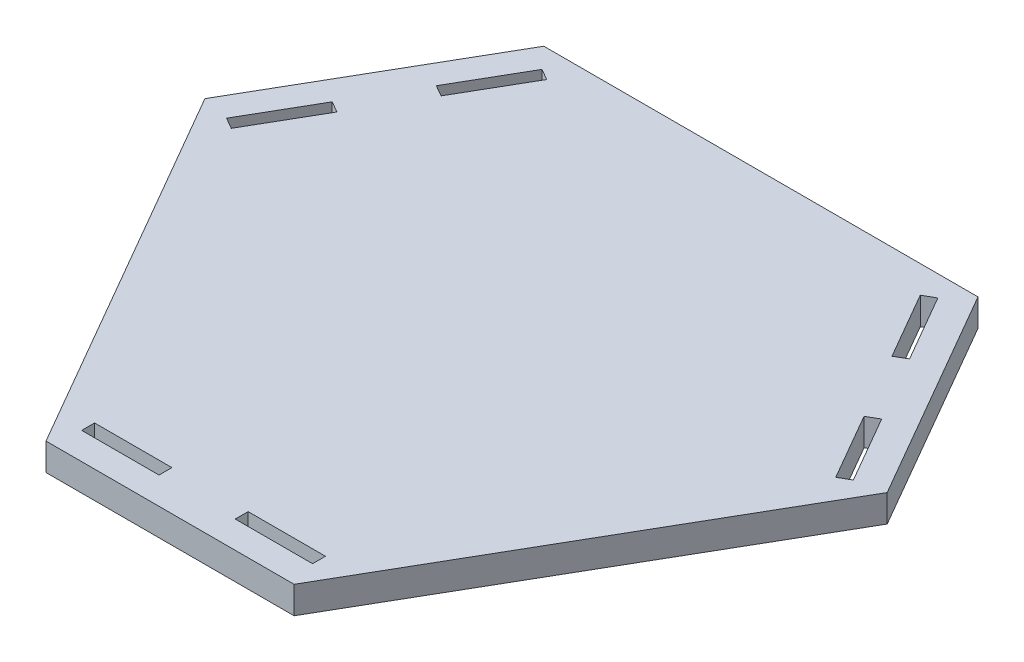
ISO-10303-21;
HEADER;
FILE_DESCRIPTION(('STEP AP214'),'2;1');
FILE_NAME('part.step','',(''),(''),'','','');
FILE_SCHEMA(('AUTOMOTIVE_DESIGN { 1 0 10303 214 1 1 1 1 }'));
ENDSEC;
DATA;
#1=APPLICATION_CONTEXT('core data for automotive mechanical design processes');
#2=APPLICATION_PROTOCOL_DEFINITION('international standard','automotive_design',2000,#1);
#3=PRODUCT_CONTEXT('',#1,'mechanical');
#4=PRODUCT('Part','Part','',(#3));
#5=PRODUCT_RELATED_PRODUCT_CATEGORY('part','',(#4));
#6=PRODUCT_DEFINITION_FORMATION('','',#4);
#7=PRODUCT_DEFINITION_CONTEXT('part definition',#1,'design');
#8=PRODUCT_DEFINITION('design','',#6,#7);
#9=PRODUCT_DEFINITION_SHAPE('','',#8);
#10=(LENGTH_UNIT() NAMED_UNIT(*) SI_UNIT(.MILLI.,.METRE.));
#11=(NAMED_UNIT(*) PLANE_ANGLE_UNIT() SI_UNIT($,.RADIAN.));
#12=(NAMED_UNIT(*) SI_UNIT($,.STERADIAN.) SOLID_ANGLE_UNIT());
#13=UNCERTAINTY_MEASURE_WITH_UNIT(LENGTH_MEASURE(1.E-05),#10,'distance_accuracy_value','');
#14=(GEOMETRIC_REPRESENTATION_CONTEXT(3) GLOBAL_UNCERTAINTY_ASSIGNED_CONTEXT((#13)) GLOBAL_UNIT_ASSIGNED_CONTEXT((#10,
#11,#12)) REPRESENTATION_CONTEXT('',''));
#15=CARTESIAN_POINT('',(0.,0.,0.));
#16=DIRECTION('',(0.,0.,1.));
#17=DIRECTION('',(1.,0.,0.));
#18=AXIS2_PLACEMENT_3D('',#15,#16,#17);
#19=CARTESIAN_POINT('',(-64.9519052838329,6.35,-37.5));
#20=DIRECTION('',(0.866025403784439,0.,0.5));
#21=DIRECTION('',(0.5,0.,-0.866025403784439));
#22=AXIS2_PLACEMENT_3D('',#19,#20,#21);
#23=PLANE('',#22);
#24=DIRECTION('',(-0.5,0.,0.866025403784439));
#25=VECTOR('',#24,1.);
#26=CARTESIAN_POINT('',(-64.9519052838329,0.,-37.5));
#27=LINE('',#26,#25);
#28=CARTESIAN_POINT('',(-50.5181485540923,0.,-62.5));
#29=VERTEX_POINT('',#28);
#30=CARTESIAN_POINT('',(-79.3856620135736,0.,-12.5));
#31=VERTEX_POINT('',#30);
#32=EDGE_CURVE('E500',#29,#31,#27,.T.);
#33=ORIENTED_EDGE('',*,*,#32,.T.);
#34=DIRECTION('',(0.,-1.,0.));
#35=VECTOR('',#34,1.);
#36=CARTESIAN_POINT('',(-79.3856620135736,6.35,-12.5));
#37=LINE('',#36,#35);
#38=CARTESIAN_POINT('',(-79.3856620135736,6.35,-12.5));
#39=VERTEX_POINT('',#38);
#40=EDGE_CURVE('E11',#39,#31,#37,.T.);
#41=ORIENTED_EDGE('',*,*,#40,.F.);
#42=DIRECTION('',(-0.5,0.,0.866025403784439));
#43=VECTOR('',#42,1.);
#44=CARTESIAN_POINT('',(-64.9519052838329,6.35,-37.5));
#45=LINE('',#44,#43);
#46=CARTESIAN_POINT('',(-50.5181485540923,6.35,-62.5));
#47=VERTEX_POINT('',#46);
#48=EDGE_CURVE('E510',#47,#39,#45,.T.);
#49=ORIENTED_EDGE('',*,*,#48,.F.);
#50=DIRECTION('',(0.,-1.,0.));
#51=VECTOR('',#50,1.);
#52=CARTESIAN_POINT('',(-50.5181485540923,6.35,-62.5));
#53=LINE('',#52,#51);
#54=EDGE_CURVE('E530',#47,#29,#53,.T.);
#55=ORIENTED_EDGE('',*,*,#54,.T.);
#56=EDGE_LOOP('',(#33,#41,#49,#55));
#57=FACE_BOUND('',#56,.T.);
#58=ADVANCED_FACE('F41',(#57),#23,.F.);
#59=CARTESIAN_POINT('',(-54.1265877365274,6.35,31.25));
#60=DIRECTION('',(0.866025403784439,0.,-0.5));
#61=DIRECTION('',(-0.5,0.,-0.866025403784439));
#62=AXIS2_PLACEMENT_3D('',#59,#60,#61);
#63=PLANE('',#62);
#64=DIRECTION('',(0.5,0.,0.866025403784439));
#65=VECTOR('',#64,1.);
#66=CARTESIAN_POINT('',(-54.1265877365274,0.,31.25));
#67=LINE('',#66,#65);
#68=CARTESIAN_POINT('',(-28.8675134594813,0.,75.));
#69=VERTEX_POINT('',#68);
#70=EDGE_CURVE('E534',#31,#69,#67,.T.);
#71=ORIENTED_EDGE('',*,*,#70,.T.);
#72=DIRECTION('',(0.,-1.,0.));
#73=VECTOR('',#72,1.);
#74=CARTESIAN_POINT('',(-28.8675134594813,6.35,75.));
#75=LINE('',#74,#73);
#76=CARTESIAN_POINT('',(-28.8675134594813,6.35,75.));
#77=VERTEX_POINT('',#76);
#78=EDGE_CURVE('E49',#77,#69,#75,.T.);
#79=ORIENTED_EDGE('',*,*,#78,.F.);
#80=DIRECTION('',(0.5,0.,0.866025403784439));
#81=VECTOR('',#80,1.);
#82=CARTESIAN_POINT('',(-54.1265877365274,6.35,31.25));
#83=LINE('',#82,#81);
#84=EDGE_CURVE('E514',#39,#77,#83,.T.);
#85=ORIENTED_EDGE('',*,*,#84,.F.);
#86=ORIENTED_EDGE('',*,*,#40,.T.);
#87=EDGE_LOOP('',(#71,#79,#85,#86));
#88=FACE_BOUND('',#87,.T.);
#89=ADVANCED_FACE('F590',(#88),#63,.F.);
#90=CARTESIAN_POINT('',(0.,6.35,75.));
#91=DIRECTION('',(0.,0.,-1.));
#92=DIRECTION('',(-1.,0.,0.));
#93=AXIS2_PLACEMENT_3D('',#90,#91,#92);
#94=PLANE('',#93);
#95=DIRECTION('',(1.,0.,0.));
#96=VECTOR('',#95,1.);
#97=CARTESIAN_POINT('',(0.,0.,75.));
#98=LINE('',#97,#96);
#99=CARTESIAN_POINT('',(28.8675134594813,0.,75.));
#100=VERTEX_POINT('',#99);
#101=EDGE_CURVE('E537',#69,#100,#98,.T.);
#102=ORIENTED_EDGE('',*,*,#101,.T.);
#103=DIRECTION('',(0.,-1.,0.));
#104=VECTOR('',#103,1.);
#105=CARTESIAN_POINT('',(28.8675134594813,6.35,75.));
#106=LINE('',#105,#104);
#107=CARTESIAN_POINT('',(28.8675134594813,6.35,75.));
#108=VERTEX_POINT('',#107);
#109=EDGE_CURVE('E559',#108,#100,#106,.T.);
#110=ORIENTED_EDGE('',*,*,#109,.F.);
#111=DIRECTION('',(1.,0.,0.));
#112=VECTOR('',#111,1.);
#113=CARTESIAN_POINT('',(0.,6.35,75.));
#114=LINE('',#113,#112);
#115=EDGE_CURVE('E518',#77,#108,#114,.T.);
#116=ORIENTED_EDGE('',*,*,#115,.F.);
#117=ORIENTED_EDGE('',*,*,#78,.T.);
#118=EDGE_LOOP('',(#102,#110,#116,#117));
#119=FACE_BOUND('',#118,.T.);
#120=ADVANCED_FACE('F568',(#119),#94,.F.);
#121=CARTESIAN_POINT('',(54.1265877365274,6.35,31.25));
#122=DIRECTION('',(-0.866025403784439,0.,-0.5));
#123=DIRECTION('',(-0.5,0.,0.866025403784439));
#124=AXIS2_PLACEMENT_3D('',#121,#122,#123);
#125=PLANE('',#124);
#126=DIRECTION('',(0.5,0.,-0.866025403784439));
#127=VECTOR('',#126,1.);
#128=CARTESIAN_POINT('',(54.1265877365274,0.,31.25));
#129=LINE('',#128,#127);
#130=CARTESIAN_POINT('',(79.3856620135736,0.,-12.5));
#131=VERTEX_POINT('',#130);
#132=EDGE_CURVE('E540',#100,#131,#129,.T.);
#133=ORIENTED_EDGE('',*,*,#132,.T.);
#134=DIRECTION('',(0.,-1.,0.));
#135=VECTOR('',#134,1.);
#136=CARTESIAN_POINT('',(79.3856620135736,6.35,-12.5));
#137=LINE('',#136,#135);
#138=CARTESIAN_POINT('',(79.3856620135736,6.35,-12.5));
#139=VERTEX_POINT('',#138);
#140=EDGE_CURVE('E555',#139,#131,#137,.T.);
#141=ORIENTED_EDGE('',*,*,#140,.F.);
#142=DIRECTION('',(0.5,0.,-0.866025403784439));
#143=VECTOR('',#142,1.);
#144=CARTESIAN_POINT('',(54.1265877365274,6.35,31.25));
#145=LINE('',#144,#143);
#146=EDGE_CURVE('E521',#108,#139,#145,.T.);
#147=ORIENTED_EDGE('',*,*,#146,.F.);
#148=ORIENTED_EDGE('',*,*,#109,.T.);
#149=EDGE_LOOP('',(#133,#141,#147,#148));
#150=FACE_BOUND('',#149,.T.);
#151=ADVANCED_FACE('F578',(#150),#125,.F.);
#152=CARTESIAN_POINT('',(64.9519052838329,6.35,-37.5));
#153=DIRECTION('',(-0.866025403784439,0.,0.5));
#154=DIRECTION('',(0.5,0.,0.866025403784439));
#155=AXIS2_PLACEMENT_3D('',#152,#153,#154);
#156=PLANE('',#155);
#157=DIRECTION('',(-0.5,0.,-0.866025403784439));
#158=VECTOR('',#157,1.);
#159=CARTESIAN_POINT('',(64.9519052838329,0.,-37.5));
#160=LINE('',#159,#158);
#161=CARTESIAN_POINT('',(50.5181485540922,0.,-62.5));
#162=VERTEX_POINT('',#161);
#163=EDGE_CURVE('E543',#131,#162,#160,.T.);
#164=ORIENTED_EDGE('',*,*,#163,.T.);
#165=DIRECTION('',(0.,-1.,0.));
#166=VECTOR('',#165,1.);
#167=CARTESIAN_POINT('',(50.5181485540922,6.35,-62.5));
#168=LINE('',#167,#166);
#169=CARTESIAN_POINT('',(50.5181485540922,6.35,-62.5));
#170=VERTEX_POINT('',#169);
#171=EDGE_CURVE('E551',#170,#162,#168,.T.);
#172=ORIENTED_EDGE('',*,*,#171,.F.);
#173=DIRECTION('',(-0.5,0.,-0.866025403784439));
#174=VECTOR('',#173,1.);
#175=CARTESIAN_POINT('',(64.9519052838329,6.35,-37.5));
#176=LINE('',#175,#174);
#177=EDGE_CURVE('E524',#139,#170,#176,.T.);
#178=ORIENTED_EDGE('',*,*,#177,.F.);
#179=ORIENTED_EDGE('',*,*,#140,.T.);
#180=EDGE_LOOP('',(#164,#172,#178,#179));
#181=FACE_BOUND('',#180,.T.);
#182=ADVANCED_FACE('F582',(#181),#156,.F.);
#183=CARTESIAN_POINT('',(0.,6.35,-62.5));
#184=DIRECTION('',(0.,0.,1.));
#185=DIRECTION('',(1.,0.,0.));
#186=AXIS2_PLACEMENT_3D('',#183,#184,#185);
#187=PLANE('',#186);
#188=DIRECTION('',(-1.,0.,0.));
#189=VECTOR('',#188,1.);
#190=CARTESIAN_POINT('',(0.,0.,-62.5));
#191=LINE('',#190,#189);
#192=EDGE_CURVE('E515',#162,#29,#191,.T.);
#193=ORIENTED_EDGE('',*,*,#192,.T.);
#194=ORIENTED_EDGE('',*,*,#54,.F.);
#195=DIRECTION('',(-1.,0.,0.));
#196=VECTOR('',#195,1.);
#197=CARTESIAN_POINT('',(0.,6.35,-62.5));
#198=LINE('',#197,#196);
#199=EDGE_CURVE('E527',#170,#47,#198,.T.);
#200=ORIENTED_EDGE('',*,*,#199,.F.);
#201=ORIENTED_EDGE('',*,*,#171,.T.);
#202=EDGE_LOOP('',(#193,#194,#200,#201));
#203=FACE_BOUND('',#202,.T.);
#204=ADVANCED_FACE('F593',(#203),#187,.F.);
#205=CARTESIAN_POINT('',(0.,6.35,0.));
#206=DIRECTION('',(0.,1.,0.));
#207=DIRECTION('',(0.,0.,1.));
#208=AXIS2_PLACEMENT_3D('',#205,#206,#207);
#209=PLANE('',#208);
#210=DIRECTION('',(0.86602540378444,0.,-0.499999999999997));
#211=VECTOR('',#210,1.);
#212=CARTESIAN_POINT('',(70.3316257583783,6.35,-9.58205080756887));
#213=LINE('',#212,#211);
#214=CARTESIAN_POINT('',(70.3316257583783,6.35,-9.58205080756887));
#215=VERTEX_POINT('',#214);
#216=CARTESIAN_POINT('',(72.9297019697316,6.35,-11.0820508075689));
#217=VERTEX_POINT('',#216);
#218=EDGE_CURVE('E56',#215,#217,#213,.T.);
#219=ORIENTED_EDGE('',*,*,#218,.F.);
#220=DIRECTION('',(0.5,0.,0.866025403784439));
#221=VECTOR('',#220,1.);
#222=CARTESIAN_POINT('',(70.3316257583783,6.35,-9.58205080756887));
#223=LINE('',#222,#221);
#224=CARTESIAN_POINT('',(61.3316257583783,6.35,-25.1705080756888));
#225=VERTEX_POINT('',#224);
#226=EDGE_CURVE('E430',#225,#215,#223,.T.);
#227=ORIENTED_EDGE('',*,*,#226,.F.);
#228=DIRECTION('',(-0.866025403784439,0.,0.499999999999999));
#229=VECTOR('',#228,1.);
#230=CARTESIAN_POINT('',(61.3316257583783,6.35,-25.1705080756888));
#231=LINE('',#230,#229);
#232=CARTESIAN_POINT('',(63.9297019697316,6.35,-26.6705080756888));
#233=VERTEX_POINT('',#232);
#234=EDGE_CURVE('E449',#233,#225,#231,.T.);
#235=ORIENTED_EDGE('',*,*,#234,.F.);
#236=DIRECTION('',(-0.5,0.,-0.866025403784439));
#237=VECTOR('',#236,1.);
#238=CARTESIAN_POINT('',(72.9297019697316,6.35,-11.0820508075689));
#239=LINE('',#238,#237);
#240=EDGE_CURVE('E445',#217,#233,#239,.T.);
#241=ORIENTED_EDGE('',*,*,#240,.F.);
#242=EDGE_LOOP('',(#219,#227,#235,#241));
#243=FACE_BOUND('',#242,.T.);
#244=DIRECTION('',(-1.,0.,0.));
#245=VECTOR('',#244,1.);
#246=CARTESIAN_POINT('',(26.8675134594813,6.35,65.7));
#247=LINE('',#246,#245);
#248=CARTESIAN_POINT('',(26.8675134594813,6.35,65.7));
#249=VERTEX_POINT('',#248);
#250=CARTESIAN_POINT('',(8.86751345948128,6.35,65.7));
#251=VERTEX_POINT('',#250);
#252=EDGE_CURVE('E64',#249,#251,#247,.T.);
#253=ORIENTED_EDGE('',*,*,#252,.F.);
#254=DIRECTION('',(0.,0.,-1.));
#255=VECTOR('',#254,1.);
#256=CARTESIAN_POINT('',(26.8675134594813,6.35,65.7));
#257=LINE('',#256,#255);
#258=CARTESIAN_POINT('',(26.8675134594813,6.35,68.7));
#259=VERTEX_POINT('',#258);
#260=EDGE_CURVE('E344',#259,#249,#257,.T.);
#261=ORIENTED_EDGE('',*,*,#260,.F.);
#262=DIRECTION('',(1.,0.,0.));
#263=VECTOR('',#262,1.);
#264=CARTESIAN_POINT('',(26.8675134594813,6.35,68.7));
#265=LINE('',#264,#263);
#266=CARTESIAN_POINT('',(8.86751345948128,6.35,68.7));
#267=VERTEX_POINT('',#266);
#268=EDGE_CURVE('E364',#267,#259,#265,.T.);
#269=ORIENTED_EDGE('',*,*,#268,.F.);
#270=DIRECTION('',(0.,0.,1.));
#271=VECTOR('',#270,1.);
#272=CARTESIAN_POINT('',(8.86751345948128,6.35,65.7));
#273=LINE('',#272,#271);
#274=EDGE_CURVE('E359',#251,#267,#273,.T.);
#275=ORIENTED_EDGE('',*,*,#274,.F.);
#276=EDGE_LOOP('',(#253,#261,#269,#275));
#277=FACE_BOUND('',#276,.T.);
#278=DIRECTION('',(-0.50000000000001,0.,0.866025403784433));
#279=VECTOR('',#278,1.);
#280=CARTESIAN_POINT('',(-46.0621885102501,6.35,-57.617949192431));
#281=LINE('',#280,#279);
#282=CARTESIAN_POINT('',(-46.0621885102501,6.35,-57.617949192431));
#283=VERTEX_POINT('',#282);
#284=CARTESIAN_POINT('',(-55.0621885102503,6.35,-42.0294919243112));
#285=VERTEX_POINT('',#284);
#286=EDGE_CURVE('E289',#283,#285,#281,.T.);
#287=ORIENTED_EDGE('',*,*,#286,.F.);
#288=DIRECTION('',(-0.866025403784438,0.,-0.500000000000001));
#289=VECTOR('',#288,1.);
#290=CARTESIAN_POINT('',(-46.0621885102501,6.35,-57.617949192431));
#291=LINE('',#290,#289);
#292=CARTESIAN_POINT('',(-43.4641122988968,6.35,-56.117949192431));
#293=VERTEX_POINT('',#292);
#294=EDGE_CURVE('E388',#293,#283,#291,.T.);
#295=ORIENTED_EDGE('',*,*,#294,.F.);
#296=DIRECTION('',(0.500000000000001,0.,-0.866025403784438));
#297=VECTOR('',#296,1.);
#298=CARTESIAN_POINT('',(-43.4641122988968,6.35,-56.117949192431));
#299=LINE('',#298,#297);
#300=CARTESIAN_POINT('',(-52.4641122988968,6.35,-40.5294919243111));
#301=VERTEX_POINT('',#300);
#302=EDGE_CURVE('E407',#301,#293,#299,.T.);
#303=ORIENTED_EDGE('',*,*,#302,.F.);
#304=DIRECTION('',(0.866025403784437,0.,0.500000000000002));
#305=VECTOR('',#304,1.);
#306=CARTESIAN_POINT('',(-55.0621885102503,6.35,-42.0294919243112));
#307=LINE('',#306,#305);
#308=EDGE_CURVE('E403',#285,#301,#307,.T.);
#309=ORIENTED_EDGE('',*,*,#308,.F.);
#310=EDGE_LOOP('',(#287,#295,#303,#309));
#311=FACE_BOUND('',#310,.T.);
#312=DIRECTION('',(0.866025403784438,0.,0.500000000000001));
#313=VECTOR('',#312,1.);
#314=CARTESIAN_POINT('',(-72.9297019697316,6.35,-11.0820508075689));
#315=LINE('',#314,#313);
#316=CARTESIAN_POINT('',(-72.9297019697316,6.35,-11.0820508075689));
#317=VERTEX_POINT('',#316);
#318=CARTESIAN_POINT('',(-70.3316257583781,6.35,-9.58205080756882));
#319=VERTEX_POINT('',#318);
#320=EDGE_CURVE('E245',#317,#319,#315,.T.);
#321=ORIENTED_EDGE('',*,*,#320,.F.);
#322=DIRECTION('',(-0.499999999999999,0.,0.866025403784439));
#323=VECTOR('',#322,1.);
#324=CARTESIAN_POINT('',(-72.9297019697316,6.35,-11.0820508075689));
#325=LINE('',#324,#323);
#326=CARTESIAN_POINT('',(-63.9297019697316,6.35,-26.6705080756888));
#327=VERTEX_POINT('',#326);
#328=EDGE_CURVE('E266',#327,#317,#325,.T.);
#329=ORIENTED_EDGE('',*,*,#328,.F.);
#330=DIRECTION('',(-0.866025403784441,0.,-0.499999999999996));
#331=VECTOR('',#330,1.);
#332=CARTESIAN_POINT('',(-63.9297019697316,6.35,-26.6705080756888));
#333=LINE('',#332,#331);
#334=CARTESIAN_POINT('',(-61.3316257583781,6.35,-25.1705080756887));
#335=VERTEX_POINT('',#334);
#336=EDGE_CURVE('E270',#335,#327,#333,.T.);
#337=ORIENTED_EDGE('',*,*,#336,.F.);
#338=DIRECTION('',(0.499999999999998,0.,-0.866025403784439));
#339=VECTOR('',#338,1.);
#340=CARTESIAN_POINT('',(-70.3316257583781,6.35,-9.58205080756882));
#341=LINE('',#340,#339);
#342=EDGE_CURVE('E279',#319,#335,#341,.T.);
#343=ORIENTED_EDGE('',*,*,#342,.F.);
#344=EDGE_LOOP('',(#321,#329,#337,#343));
#345=FACE_BOUND('',#344,.T.);
#346=DIRECTION('',(0.5,0.,0.866025403784439));
#347=VECTOR('',#346,1.);
#348=CARTESIAN_POINT('',(43.464112298897,6.35,-56.1179491924311));
#349=LINE('',#348,#347);
#350=CARTESIAN_POINT('',(43.464112298897,6.35,-56.1179491924311));
#351=VERTEX_POINT('',#350);
#352=CARTESIAN_POINT('',(52.464112298897,6.35,-40.5294919243112));
#353=VERTEX_POINT('',#352);
#354=EDGE_CURVE('E313',#351,#353,#349,.T.);
#355=ORIENTED_EDGE('',*,*,#354,.F.);
#356=DIRECTION('',(-0.866025403784438,0.,0.500000000000001));
#357=VECTOR('',#356,1.);
#358=CARTESIAN_POINT('',(43.464112298897,6.35,-56.1179491924311));
#359=LINE('',#358,#357);
#360=CARTESIAN_POINT('',(46.0621885102503,6.35,-57.6179491924311));
#361=VERTEX_POINT('',#360);
#362=EDGE_CURVE('E300',#361,#351,#359,.T.);
#363=ORIENTED_EDGE('',*,*,#362,.F.);
#364=DIRECTION('',(-0.5,0.,-0.866025403784439));
#365=VECTOR('',#364,1.);
#366=CARTESIAN_POINT('',(46.0621885102503,6.35,-57.6179491924311));
#367=LINE('',#366,#365);
#368=CARTESIAN_POINT('',(55.0621885102503,6.35,-42.0294919243112));
#369=VERTEX_POINT('',#368);
#370=EDGE_CURVE('E321',#369,#361,#367,.T.);
#371=ORIENTED_EDGE('',*,*,#370,.F.);
#372=DIRECTION('',(0.866025403784438,0.,-0.500000000000001));
#373=VECTOR('',#372,1.);
#374=CARTESIAN_POINT('',(52.464112298897,6.35,-40.5294919243112));
#375=LINE('',#374,#373);
#376=EDGE_CURVE('E316',#353,#369,#375,.T.);
#377=ORIENTED_EDGE('',*,*,#376,.F.);
#378=EDGE_LOOP('',(#355,#363,#371,#377));
#379=FACE_BOUND('',#378,.T.);
#380=DIRECTION('',(0.,0.,1.));
#381=VECTOR('',#380,1.);
#382=CARTESIAN_POINT('',(-26.8675134594813,6.35,65.7));
#383=LINE('',#382,#381);
#384=CARTESIAN_POINT('',(-26.8675134594813,6.35,65.7));
#385=VERTEX_POINT('',#384);
#386=CARTESIAN_POINT('',(-26.8675134594813,6.35,68.7));
#387=VERTEX_POINT('',#386);
#388=EDGE_CURVE('E374',#385,#387,#383,.T.);
#389=ORIENTED_EDGE('',*,*,#388,.F.);
#390=DIRECTION('',(-1.,0.,0.));
#391=VECTOR('',#390,1.);
#392=CARTESIAN_POINT('',(-26.8675134594813,6.35,65.7));
#393=LINE('',#392,#391);
#394=CARTESIAN_POINT('',(-8.86751345948128,6.35,65.7));
#395=VERTEX_POINT('',#394);
#396=EDGE_CURVE('E471',#395,#385,#393,.T.);
#397=ORIENTED_EDGE('',*,*,#396,.F.);
#398=DIRECTION('',(0.,0.,-1.));
#399=VECTOR('',#398,1.);
#400=CARTESIAN_POINT('',(-8.86751345948128,6.35,65.7));
#401=LINE('',#400,#399);
#402=CARTESIAN_POINT('',(-8.86751345948128,6.35,68.7));
#403=VERTEX_POINT('',#402);
#404=EDGE_CURVE('E490',#403,#395,#401,.T.);
#405=ORIENTED_EDGE('',*,*,#404,.F.);
#406=DIRECTION('',(1.,0.,0.));
#407=VECTOR('',#406,1.);
#408=CARTESIAN_POINT('',(-26.8675134594813,6.35,68.7));
#409=LINE('',#408,#407);
#410=EDGE_CURVE('E486',#387,#403,#409,.T.);
#411=ORIENTED_EDGE('',*,*,#410,.F.);
#412=EDGE_LOOP('',(#389,#397,#405,#411));
#413=FACE_BOUND('',#412,.T.);
#414=ORIENTED_EDGE('',*,*,#48,.T.);
#415=ORIENTED_EDGE('',*,*,#84,.T.);
#416=ORIENTED_EDGE('',*,*,#115,.T.);
#417=ORIENTED_EDGE('',*,*,#146,.T.);
#418=ORIENTED_EDGE('',*,*,#177,.T.);
#419=ORIENTED_EDGE('',*,*,#199,.T.);
#420=EDGE_LOOP('',(#414,#415,#416,#417,#418,#419));
#421=FACE_BOUND('',#420,.T.);
#422=ADVANCED_FACE('F586',(#243,#277,#311,#345,#379,#413,#421),#209,.T.);
#423=CARTESIAN_POINT('',(0.,0.,0.));
#424=DIRECTION('',(0.,1.,0.));
#425=DIRECTION('',(0.,0.,1.));
#426=AXIS2_PLACEMENT_3D('',#423,#424,#425);
#427=PLANE('',#426);
#428=DIRECTION('',(0.5,0.,0.866025403784439));
#429=VECTOR('',#428,1.);
#430=CARTESIAN_POINT('',(70.3316257583783,0.,-9.58205080756887));
#431=LINE('',#430,#429);
#432=CARTESIAN_POINT('',(61.3316257583783,0.,-25.1705080756888));
#433=VERTEX_POINT('',#432);
#434=CARTESIAN_POINT('',(70.3316257583783,0.,-9.58205080756887));
#435=VERTEX_POINT('',#434);
#436=EDGE_CURVE('E438',#433,#435,#431,.T.);
#437=ORIENTED_EDGE('',*,*,#436,.T.);
#438=DIRECTION('',(0.86602540378444,0.,-0.499999999999997));
#439=VECTOR('',#438,1.);
#440=CARTESIAN_POINT('',(70.3316257583783,0.,-9.58205080756887));
#441=LINE('',#440,#439);
#442=CARTESIAN_POINT('',(72.9297019697316,0.,-11.0820508075689));
#443=VERTEX_POINT('',#442);
#444=EDGE_CURVE('E425',#435,#443,#441,.T.);
#445=ORIENTED_EDGE('',*,*,#444,.T.);
#446=DIRECTION('',(-0.5,0.,-0.866025403784439));
#447=VECTOR('',#446,1.);
#448=CARTESIAN_POINT('',(72.9297019697316,0.,-11.0820508075689));
#449=LINE('',#448,#447);
#450=CARTESIAN_POINT('',(63.9297019697316,0.,-26.6705080756888));
#451=VERTEX_POINT('',#450);
#452=EDGE_CURVE('E429',#443,#451,#449,.T.);
#453=ORIENTED_EDGE('',*,*,#452,.T.);
#454=DIRECTION('',(-0.866025403784439,0.,0.499999999999999));
#455=VECTOR('',#454,1.);
#456=CARTESIAN_POINT('',(61.3316257583783,0.,-25.1705080756888));
#457=LINE('',#456,#455);
#458=EDGE_CURVE('E434',#451,#433,#457,.T.);
#459=ORIENTED_EDGE('',*,*,#458,.T.);
#460=EDGE_LOOP('',(#437,#445,#453,#459));
#461=FACE_BOUND('',#460,.T.);
#462=DIRECTION('',(0.,0.,-1.));
#463=VECTOR('',#462,1.);
#464=CARTESIAN_POINT('',(26.8675134594813,0.,65.7));
#465=LINE('',#464,#463);
#466=CARTESIAN_POINT('',(26.8675134594813,0.,68.7));
#467=VERTEX_POINT('',#466);
#468=CARTESIAN_POINT('',(26.8675134594813,0.,65.7));
#469=VERTEX_POINT('',#468);
#470=EDGE_CURVE('E352',#467,#469,#465,.T.);
#471=ORIENTED_EDGE('',*,*,#470,.T.);
#472=DIRECTION('',(-1.,0.,0.));
#473=VECTOR('',#472,1.);
#474=CARTESIAN_POINT('',(26.8675134594813,0.,65.7));
#475=LINE('',#474,#473);
#476=CARTESIAN_POINT('',(8.86751345948128,0.,65.7));
#477=VERTEX_POINT('',#476);
#478=EDGE_CURVE('E339',#469,#477,#475,.T.);
#479=ORIENTED_EDGE('',*,*,#478,.T.);
#480=DIRECTION('',(0.,0.,1.));
#481=VECTOR('',#480,1.);
#482=CARTESIAN_POINT('',(8.86751345948128,0.,65.7));
#483=LINE('',#482,#481);
#484=CARTESIAN_POINT('',(8.86751345948128,0.,68.7));
#485=VERTEX_POINT('',#484);
#486=EDGE_CURVE('E343',#477,#485,#483,.T.);
#487=ORIENTED_EDGE('',*,*,#486,.T.);
#488=DIRECTION('',(1.,0.,0.));
#489=VECTOR('',#488,1.);
#490=CARTESIAN_POINT('',(26.8675134594813,0.,68.7));
#491=LINE('',#490,#489);
#492=EDGE_CURVE('E348',#485,#467,#491,.T.);
#493=ORIENTED_EDGE('',*,*,#492,.T.);
#494=EDGE_LOOP('',(#471,#479,#487,#493));
#495=FACE_BOUND('',#494,.T.);
#496=DIRECTION('',(-0.866025403784438,0.,-0.500000000000001));
#497=VECTOR('',#496,1.);
#498=CARTESIAN_POINT('',(-46.0621885102501,0.,-57.617949192431));
#499=LINE('',#498,#497);
#500=CARTESIAN_POINT('',(-43.4641122988968,0.,-56.117949192431));
#501=VERTEX_POINT('',#500);
#502=CARTESIAN_POINT('',(-46.0621885102501,0.,-57.617949192431));
#503=VERTEX_POINT('',#502);
#504=EDGE_CURVE('E396',#501,#503,#499,.T.);
#505=ORIENTED_EDGE('',*,*,#504,.T.);
#506=DIRECTION('',(-0.50000000000001,0.,0.866025403784433));
#507=VECTOR('',#506,1.);
#508=CARTESIAN_POINT('',(-46.0621885102501,0.,-57.617949192431));
#509=LINE('',#508,#507);
#510=CARTESIAN_POINT('',(-55.0621885102503,0.,-42.0294919243112));
#511=VERTEX_POINT('',#510);
#512=EDGE_CURVE('E383',#503,#511,#509,.T.);
#513=ORIENTED_EDGE('',*,*,#512,.T.);
#514=DIRECTION('',(0.866025403784437,0.,0.500000000000002));
#515=VECTOR('',#514,1.);
#516=CARTESIAN_POINT('',(-55.0621885102503,0.,-42.0294919243112));
#517=LINE('',#516,#515);
#518=CARTESIAN_POINT('',(-52.4641122988968,0.,-40.5294919243111));
#519=VERTEX_POINT('',#518);
#520=EDGE_CURVE('E387',#511,#519,#517,.T.);
#521=ORIENTED_EDGE('',*,*,#520,.T.);
#522=DIRECTION('',(0.500000000000001,0.,-0.866025403784438));
#523=VECTOR('',#522,1.);
#524=CARTESIAN_POINT('',(-43.4641122988968,0.,-56.117949192431));
#525=LINE('',#524,#523);
#526=EDGE_CURVE('E392',#519,#501,#525,.T.);
#527=ORIENTED_EDGE('',*,*,#526,.T.);
#528=EDGE_LOOP('',(#505,#513,#521,#527));
#529=FACE_BOUND('',#528,.T.);
#530=DIRECTION('',(-0.499999999999999,0.,0.866025403784439));
#531=VECTOR('',#530,1.);
#532=CARTESIAN_POINT('',(-72.9297019697316,0.,-11.0820508075689));
#533=LINE('',#532,#531);
#534=CARTESIAN_POINT('',(-63.9297019697316,0.,-26.6705080756888));
#535=VERTEX_POINT('',#534);
#536=CARTESIAN_POINT('',(-72.9297019697316,0.,-11.0820508075689));
#537=VERTEX_POINT('',#536);
#538=EDGE_CURVE('E251',#535,#537,#533,.T.);
#539=ORIENTED_EDGE('',*,*,#538,.T.);
#540=DIRECTION('',(0.866025403784438,0.,0.500000000000001));
#541=VECTOR('',#540,1.);
#542=CARTESIAN_POINT('',(-72.9297019697316,0.,-11.0820508075689));
#543=LINE('',#542,#541);
#544=CARTESIAN_POINT('',(-70.3316257583781,0.,-9.58205080756882));
#545=VERTEX_POINT('',#544);
#546=EDGE_CURVE('E242',#537,#545,#543,.T.);
#547=ORIENTED_EDGE('',*,*,#546,.T.);
#548=DIRECTION('',(0.499999999999998,0.,-0.866025403784439));
#549=VECTOR('',#548,1.);
#550=CARTESIAN_POINT('',(-70.3316257583781,0.,-9.58205080756882));
#551=LINE('',#550,#549);
#552=CARTESIAN_POINT('',(-61.3316257583781,0.,-25.1705080756887));
#553=VERTEX_POINT('',#552);
#554=EDGE_CURVE('E255',#545,#553,#551,.T.);
#555=ORIENTED_EDGE('',*,*,#554,.T.);
#556=DIRECTION('',(-0.866025403784441,0.,-0.499999999999996));
#557=VECTOR('',#556,1.);
#558=CARTESIAN_POINT('',(-63.9297019697316,0.,-26.6705080756888));
#559=LINE('',#558,#557);
#560=EDGE_CURVE('E260',#553,#535,#559,.T.);
#561=ORIENTED_EDGE('',*,*,#560,.T.);
#562=EDGE_LOOP('',(#539,#547,#555,#561));
#563=FACE_BOUND('',#562,.T.);
#564=DIRECTION('',(-0.866025403784438,0.,0.500000000000001));
#565=VECTOR('',#564,1.);
#566=CARTESIAN_POINT('',(43.464112298897,0.,-56.1179491924311));
#567=LINE('',#566,#565);
#568=CARTESIAN_POINT('',(46.0621885102503,0.,-57.6179491924311));
#569=VERTEX_POINT('',#568);
#570=CARTESIAN_POINT('',(43.464112298897,0.,-56.1179491924311));
#571=VERTEX_POINT('',#570);
#572=EDGE_CURVE('E308',#569,#571,#567,.T.);
#573=ORIENTED_EDGE('',*,*,#572,.T.);
#574=DIRECTION('',(0.5,0.,0.866025403784439));
#575=VECTOR('',#574,1.);
#576=CARTESIAN_POINT('',(43.464112298897,0.,-56.1179491924311));
#577=LINE('',#576,#575);
#578=CARTESIAN_POINT('',(52.464112298897,0.,-40.5294919243112));
#579=VERTEX_POINT('',#578);
#580=EDGE_CURVE('E295',#571,#579,#577,.T.);
#581=ORIENTED_EDGE('',*,*,#580,.T.);
#582=DIRECTION('',(0.866025403784438,0.,-0.500000000000001));
#583=VECTOR('',#582,1.);
#584=CARTESIAN_POINT('',(52.464112298897,0.,-40.5294919243112));
#585=LINE('',#584,#583);
#586=CARTESIAN_POINT('',(55.0621885102503,0.,-42.0294919243112));
#587=VERTEX_POINT('',#586);
#588=EDGE_CURVE('E299',#579,#587,#585,.T.);
#589=ORIENTED_EDGE('',*,*,#588,.T.);
#590=DIRECTION('',(-0.5,0.,-0.866025403784439));
#591=VECTOR('',#590,1.);
#592=CARTESIAN_POINT('',(46.0621885102503,0.,-57.6179491924311));
#593=LINE('',#592,#591);
#594=EDGE_CURVE('E304',#587,#569,#593,.T.);
#595=ORIENTED_EDGE('',*,*,#594,.T.);
#596=EDGE_LOOP('',(#573,#581,#589,#595));
#597=FACE_BOUND('',#596,.T.);
#598=DIRECTION('',(-1.,0.,0.));
#599=VECTOR('',#598,1.);
#600=CARTESIAN_POINT('',(-26.8675134594813,0.,65.7));
#601=LINE('',#600,#599);
#602=CARTESIAN_POINT('',(-8.86751345948128,0.,65.7));
#603=VERTEX_POINT('',#602);
#604=CARTESIAN_POINT('',(-26.8675134594813,0.,65.7));
#605=VERTEX_POINT('',#604);
#606=EDGE_CURVE('E479',#603,#605,#601,.T.);
#607=ORIENTED_EDGE('',*,*,#606,.T.);
#608=DIRECTION('',(0.,0.,1.));
#609=VECTOR('',#608,1.);
#610=CARTESIAN_POINT('',(-26.8675134594813,0.,65.7));
#611=LINE('',#610,#609);
#612=CARTESIAN_POINT('',(-26.8675134594813,0.,68.7));
#613=VERTEX_POINT('',#612);
#614=EDGE_CURVE('E466',#605,#613,#611,.T.);
#615=ORIENTED_EDGE('',*,*,#614,.T.);
#616=DIRECTION('',(1.,0.,0.));
#617=VECTOR('',#616,1.);
#618=CARTESIAN_POINT('',(-26.8675134594813,0.,68.7));
#619=LINE('',#618,#617);
#620=CARTESIAN_POINT('',(-8.86751345948128,0.,68.7));
#621=VERTEX_POINT('',#620);
#622=EDGE_CURVE('E470',#613,#621,#619,.T.);
#623=ORIENTED_EDGE('',*,*,#622,.T.);
#624=DIRECTION('',(0.,0.,-1.));
#625=VECTOR('',#624,1.);
#626=CARTESIAN_POINT('',(-8.86751345948128,0.,65.7));
#627=LINE('',#626,#625);
#628=EDGE_CURVE('E475',#621,#603,#627,.T.);
#629=ORIENTED_EDGE('',*,*,#628,.T.);
#630=EDGE_LOOP('',(#607,#615,#623,#629));
#631=FACE_BOUND('',#630,.T.);
#632=ORIENTED_EDGE('',*,*,#32,.F.);
#633=ORIENTED_EDGE('',*,*,#192,.F.);
#634=ORIENTED_EDGE('',*,*,#163,.F.);
#635=ORIENTED_EDGE('',*,*,#132,.F.);
#636=ORIENTED_EDGE('',*,*,#101,.F.);
#637=ORIENTED_EDGE('',*,*,#70,.F.);
#638=EDGE_LOOP('',(#632,#633,#634,#635,#636,#637));
#639=FACE_BOUND('',#638,.T.);
#640=ADVANCED_FACE('F262',(#461,#495,#529,#563,#597,#631,#639),#427,.F.);
#641=CARTESIAN_POINT('',(-26.8675134594813,0.,65.7));
#642=DIRECTION('',(-1.,0.,0.));
#643=DIRECTION('',(0.,0.,1.));
#644=AXIS2_PLACEMENT_3D('',#641,#642,#643);
#645=PLANE('',#644);
#646=ORIENTED_EDGE('',*,*,#388,.T.);
#647=DIRECTION('',(0.,1.,0.));
#648=VECTOR('',#647,1.);
#649=CARTESIAN_POINT('',(-26.8675134594813,0.,68.7));
#650=LINE('',#649,#648);
#651=EDGE_CURVE('E483',#613,#387,#650,.T.);
#652=ORIENTED_EDGE('',*,*,#651,.F.);
#653=ORIENTED_EDGE('',*,*,#614,.F.);
#654=DIRECTION('',(0.,1.,0.));
#655=VECTOR('',#654,1.);
#656=CARTESIAN_POINT('',(-26.8675134594813,0.,65.7));
#657=LINE('',#656,#655);
#658=EDGE_CURVE('E497',#605,#385,#657,.T.);
#659=ORIENTED_EDGE('',*,*,#658,.T.);
#660=EDGE_LOOP('',(#646,#652,#653,#659));
#661=FACE_BOUND('',#660,.T.);
#662=ADVANCED_FACE('F641',(#661),#645,.F.);
#663=CARTESIAN_POINT('',(-26.8675134594813,0.,65.7));
#664=DIRECTION('',(0.,0.,-1.));
#665=DIRECTION('',(-1.,0.,0.));
#666=AXIS2_PLACEMENT_3D('',#663,#664,#665);
#667=PLANE('',#666);
#668=ORIENTED_EDGE('',*,*,#396,.T.);
#669=ORIENTED_EDGE('',*,*,#658,.F.);
#670=ORIENTED_EDGE('',*,*,#606,.F.);
#671=DIRECTION('',(0.,1.,0.));
#672=VECTOR('',#671,1.);
#673=CARTESIAN_POINT('',(-8.86751345948128,0.,65.7));
#674=LINE('',#673,#672);
#675=EDGE_CURVE('E501',#603,#395,#674,.T.);
#676=ORIENTED_EDGE('',*,*,#675,.T.);
#677=EDGE_LOOP('',(#668,#669,#670,#676));
#678=FACE_BOUND('',#677,.T.);
#679=ADVANCED_FACE('F650',(#678),#667,.F.);
#680=CARTESIAN_POINT('',(-8.86751345948128,0.,65.7));
#681=DIRECTION('',(1.,0.,0.));
#682=DIRECTION('',(0.,0.,-1.));
#683=AXIS2_PLACEMENT_3D('',#680,#681,#682);
#684=PLANE('',#683);
#685=ORIENTED_EDGE('',*,*,#404,.T.);
#686=ORIENTED_EDGE('',*,*,#675,.F.);
#687=ORIENTED_EDGE('',*,*,#628,.F.);
#688=DIRECTION('',(0.,1.,0.));
#689=VECTOR('',#688,1.);
#690=CARTESIAN_POINT('',(-8.86751345948128,0.,68.7));
#691=LINE('',#690,#689);
#692=EDGE_CURVE('E504',#621,#403,#691,.T.);
#693=ORIENTED_EDGE('',*,*,#692,.T.);
#694=EDGE_LOOP('',(#685,#686,#687,#693));
#695=FACE_BOUND('',#694,.T.);
#696=ADVANCED_FACE('F660',(#695),#684,.F.);
#697=CARTESIAN_POINT('',(-26.8675134594813,0.,68.7));
#698=DIRECTION('',(0.,0.,1.));
#699=DIRECTION('',(1.,0.,0.));
#700=AXIS2_PLACEMENT_3D('',#697,#698,#699);
#701=PLANE('',#700);
#702=ORIENTED_EDGE('',*,*,#410,.T.);
#703=ORIENTED_EDGE('',*,*,#692,.F.);
#704=ORIENTED_EDGE('',*,*,#622,.F.);
#705=ORIENTED_EDGE('',*,*,#651,.T.);
#706=EDGE_LOOP('',(#702,#703,#704,#705));
#707=FACE_BOUND('',#706,.T.);
#708=ADVANCED_FACE('F670',(#707),#701,.F.);
#709=CARTESIAN_POINT('',(43.464112298897,0.,-56.1179491924311));
#710=DIRECTION('',(-0.866025403784439,0.,0.5));
#711=DIRECTION('',(0.5,0.,0.866025403784439));
#712=AXIS2_PLACEMENT_3D('',#709,#710,#711);
#713=PLANE('',#712);
#714=ORIENTED_EDGE('',*,*,#354,.T.);
#715=DIRECTION('',(0.,1.,0.));
#716=VECTOR('',#715,1.);
#717=CARTESIAN_POINT('',(52.464112298897,0.,-40.5294919243112));
#718=LINE('',#717,#716);
#719=EDGE_CURVE('E312',#579,#353,#718,.T.);
#720=ORIENTED_EDGE('',*,*,#719,.F.);
#721=ORIENTED_EDGE('',*,*,#580,.F.);
#722=DIRECTION('',(0.,1.,0.));
#723=VECTOR('',#722,1.);
#724=CARTESIAN_POINT('',(43.464112298897,0.,-56.1179491924311));
#725=LINE('',#724,#723);
#726=EDGE_CURVE('E280',#571,#351,#725,.T.);
#727=ORIENTED_EDGE('',*,*,#726,.T.);
#728=EDGE_LOOP('',(#714,#720,#721,#727));
#729=FACE_BOUND('',#728,.T.);
#730=ADVANCED_FACE('F680',(#729),#713,.F.);
#731=CARTESIAN_POINT('',(43.464112298897,0.,-56.1179491924311));
#732=DIRECTION('',(-0.500000000000001,0.,-0.866025403784438));
#733=DIRECTION('',(-0.866025403784438,0.,0.500000000000001));
#734=AXIS2_PLACEMENT_3D('',#731,#732,#733);
#735=PLANE('',#734);
#736=ORIENTED_EDGE('',*,*,#362,.T.);
#737=ORIENTED_EDGE('',*,*,#726,.F.);
#738=ORIENTED_EDGE('',*,*,#572,.F.);
#739=DIRECTION('',(0.,1.,0.));
#740=VECTOR('',#739,1.);
#741=CARTESIAN_POINT('',(46.0621885102503,0.,-57.6179491924311));
#742=LINE('',#741,#740);
#743=EDGE_CURVE('E330',#569,#361,#742,.T.);
#744=ORIENTED_EDGE('',*,*,#743,.T.);
#745=EDGE_LOOP('',(#736,#737,#738,#744));
#746=FACE_BOUND('',#745,.T.);
#747=ADVANCED_FACE('F690',(#746),#735,.F.);
#748=CARTESIAN_POINT('',(46.0621885102503,0.,-57.6179491924311));
#749=DIRECTION('',(0.866025403784439,0.,-0.5));
#750=DIRECTION('',(-0.5,0.,-0.866025403784439));
#751=AXIS2_PLACEMENT_3D('',#748,#749,#750);
#752=PLANE('',#751);
#753=ORIENTED_EDGE('',*,*,#370,.T.);
#754=ORIENTED_EDGE('',*,*,#743,.F.);
#755=ORIENTED_EDGE('',*,*,#594,.F.);
#756=DIRECTION('',(0.,1.,0.));
#757=VECTOR('',#756,1.);
#758=CARTESIAN_POINT('',(55.0621885102503,0.,-42.0294919243112));
#759=LINE('',#758,#757);
#760=EDGE_CURVE('E333',#587,#369,#759,.T.);
#761=ORIENTED_EDGE('',*,*,#760,.T.);
#762=EDGE_LOOP('',(#753,#754,#755,#761));
#763=FACE_BOUND('',#762,.T.);
#764=ADVANCED_FACE('F700',(#763),#752,.F.);
#765=CARTESIAN_POINT('',(52.464112298897,0.,-40.5294919243112));
#766=DIRECTION('',(0.500000000000001,0.,0.866025403784438));
#767=DIRECTION('',(0.866025403784438,0.,-0.500000000000001));
#768=AXIS2_PLACEMENT_3D('',#765,#766,#767);
#769=PLANE('',#768);
#770=ORIENTED_EDGE('',*,*,#376,.T.);
#771=ORIENTED_EDGE('',*,*,#760,.F.);
#772=ORIENTED_EDGE('',*,*,#588,.F.);
#773=ORIENTED_EDGE('',*,*,#719,.T.);
#774=EDGE_LOOP('',(#770,#771,#772,#773));
#775=FACE_BOUND('',#774,.T.);
#776=ADVANCED_FACE('F710',(#775),#769,.F.);
#777=CARTESIAN_POINT('',(-72.9297019697316,0.,-11.0820508075689));
#778=DIRECTION('',(-0.500000000000001,0.,0.866025403784438));
#779=DIRECTION('',(0.866025403784438,0.,0.500000000000001));
#780=AXIS2_PLACEMENT_3D('',#777,#778,#779);
#781=PLANE('',#780);
#782=ORIENTED_EDGE('',*,*,#320,.T.);
#783=DIRECTION('',(0.,1.,0.));
#784=VECTOR('',#783,1.);
#785=CARTESIAN_POINT('',(-70.3316257583781,0.,-9.58205080756882));
#786=LINE('',#785,#784);
#787=EDGE_CURVE('E238',#545,#319,#786,.T.);
#788=ORIENTED_EDGE('',*,*,#787,.F.);
#789=ORIENTED_EDGE('',*,*,#546,.F.);
#790=DIRECTION('',(0.,1.,0.));
#791=VECTOR('',#790,1.);
#792=CARTESIAN_POINT('',(-72.9297019697316,0.,-11.0820508075689));
#793=LINE('',#792,#791);
#794=EDGE_CURVE('E286',#537,#317,#793,.T.);
#795=ORIENTED_EDGE('',*,*,#794,.T.);
#796=EDGE_LOOP('',(#782,#788,#789,#795));
#797=FACE_BOUND('',#796,.T.);
#798=ADVANCED_FACE('F240',(#797),#781,.F.);
#799=CARTESIAN_POINT('',(-72.9297019697316,0.,-11.0820508075689));
#800=DIRECTION('',(-0.866025403784439,0.,-0.499999999999999));
#801=DIRECTION('',(-0.499999999999999,0.,0.866025403784439));
#802=AXIS2_PLACEMENT_3D('',#799,#800,#801);
#803=PLANE('',#802);
#804=ORIENTED_EDGE('',*,*,#328,.T.);
#805=ORIENTED_EDGE('',*,*,#794,.F.);
#806=ORIENTED_EDGE('',*,*,#538,.F.);
#807=DIRECTION('',(0.,1.,0.));
#808=VECTOR('',#807,1.);
#809=CARTESIAN_POINT('',(-63.9297019697316,0.,-26.6705080756888));
#810=LINE('',#809,#808);
#811=EDGE_CURVE('E290',#535,#327,#810,.T.);
#812=ORIENTED_EDGE('',*,*,#811,.T.);
#813=EDGE_LOOP('',(#804,#805,#806,#812));
#814=FACE_BOUND('',#813,.T.);
#815=ADVANCED_FACE('F729',(#814),#803,.F.);
#816=CARTESIAN_POINT('',(-63.9297019697316,0.,-26.6705080756888));
#817=DIRECTION('',(0.499999999999996,0.,-0.866025403784441));
#818=DIRECTION('',(-0.866025403784441,0.,-0.499999999999996));
#819=AXIS2_PLACEMENT_3D('',#816,#817,#818);
#820=PLANE('',#819);
#821=ORIENTED_EDGE('',*,*,#336,.T.);
#822=ORIENTED_EDGE('',*,*,#811,.F.);
#823=ORIENTED_EDGE('',*,*,#560,.F.);
#824=DIRECTION('',(0.,1.,0.));
#825=VECTOR('',#824,1.);
#826=CARTESIAN_POINT('',(-61.3316257583781,0.,-25.1705080756887));
#827=LINE('',#826,#825);
#828=EDGE_CURVE('E250',#553,#335,#827,.T.);
#829=ORIENTED_EDGE('',*,*,#828,.T.);
#830=EDGE_LOOP('',(#821,#822,#823,#829));
#831=FACE_BOUND('',#830,.T.);
#832=ADVANCED_FACE('F738',(#831),#820,.F.);
#833=CARTESIAN_POINT('',(-70.3316257583781,0.,-9.58205080756882));
#834=DIRECTION('',(0.866025403784439,0.,0.499999999999998));
#835=DIRECTION('',(0.499999999999999,0.,-0.86602540378444));
#836=AXIS2_PLACEMENT_3D('',#833,#834,#835);
#837=PLANE('',#836);
#838=ORIENTED_EDGE('',*,*,#342,.T.);
#839=ORIENTED_EDGE('',*,*,#828,.F.);
#840=ORIENTED_EDGE('',*,*,#554,.F.);
#841=ORIENTED_EDGE('',*,*,#787,.T.);
#842=EDGE_LOOP('',(#838,#839,#840,#841));
#843=FACE_BOUND('',#842,.T.);
#844=ADVANCED_FACE('F256',(#843),#837,.F.);
#845=CARTESIAN_POINT('',(-46.0621885102501,0.,-57.617949192431));
#846=DIRECTION('',(-0.866025403784433,0.,-0.50000000000001));
#847=DIRECTION('',(-0.50000000000001,0.,0.866025403784433));
#848=AXIS2_PLACEMENT_3D('',#845,#846,#847);
#849=PLANE('',#848);
#850=ORIENTED_EDGE('',*,*,#286,.T.);
#851=DIRECTION('',(0.,1.,0.));
#852=VECTOR('',#851,1.);
#853=CARTESIAN_POINT('',(-55.0621885102503,0.,-42.0294919243112));
#854=LINE('',#853,#852);
#855=EDGE_CURVE('E400',#511,#285,#854,.T.);
#856=ORIENTED_EDGE('',*,*,#855,.F.);
#857=ORIENTED_EDGE('',*,*,#512,.F.);
#858=DIRECTION('',(0.,1.,0.));
#859=VECTOR('',#858,1.);
#860=CARTESIAN_POINT('',(-46.0621885102501,0.,-57.617949192431));
#861=LINE('',#860,#859);
#862=EDGE_CURVE('E360',#503,#283,#861,.T.);
#863=ORIENTED_EDGE('',*,*,#862,.T.);
#864=EDGE_LOOP('',(#850,#856,#857,#863));
#865=FACE_BOUND('',#864,.T.);
#866=ADVANCED_FACE('F757',(#865),#849,.F.);
#867=CARTESIAN_POINT('',(-46.0621885102501,0.,-57.617949192431));
#868=DIRECTION('',(0.500000000000001,0.,-0.866025403784438));
#869=DIRECTION('',(-0.866025403784438,0.,-0.500000000000001));
#870=AXIS2_PLACEMENT_3D('',#867,#868,#869);
#871=PLANE('',#870);
#872=ORIENTED_EDGE('',*,*,#294,.T.);
#873=ORIENTED_EDGE('',*,*,#862,.F.);
#874=ORIENTED_EDGE('',*,*,#504,.F.);
#875=DIRECTION('',(0.,1.,0.));
#876=VECTOR('',#875,1.);
#877=CARTESIAN_POINT('',(-43.4641122988968,0.,-56.117949192431));
#878=LINE('',#877,#876);
#879=EDGE_CURVE('E416',#501,#293,#878,.T.);
#880=ORIENTED_EDGE('',*,*,#879,.T.);
#881=EDGE_LOOP('',(#872,#873,#874,#880));
#882=FACE_BOUND('',#881,.T.);
#883=ADVANCED_FACE('F766',(#882),#871,.F.);
#884=CARTESIAN_POINT('',(-43.4641122988968,0.,-56.117949192431));
#885=DIRECTION('',(0.866025403784438,0.,0.500000000000001));
#886=DIRECTION('',(0.500000000000001,0.,-0.866025403784438));
#887=AXIS2_PLACEMENT_3D('',#884,#885,#886);
#888=PLANE('',#887);
#889=ORIENTED_EDGE('',*,*,#302,.T.);
#890=ORIENTED_EDGE('',*,*,#879,.F.);
#891=ORIENTED_EDGE('',*,*,#526,.F.);
#892=DIRECTION('',(0.,1.,0.));
#893=VECTOR('',#892,1.);
#894=CARTESIAN_POINT('',(-52.4641122988968,0.,-40.5294919243111));
#895=LINE('',#894,#893);
#896=EDGE_CURVE('E419',#519,#301,#895,.T.);
#897=ORIENTED_EDGE('',*,*,#896,.T.);
#898=EDGE_LOOP('',(#889,#890,#891,#897));
#899=FACE_BOUND('',#898,.T.);
#900=ADVANCED_FACE('F776',(#899),#888,.F.);
#901=CARTESIAN_POINT('',(-55.0621885102503,0.,-42.0294919243112));
#902=DIRECTION('',(-0.500000000000002,0.,0.866025403784437));
#903=DIRECTION('',(0.866025403784437,0.,0.500000000000002));
#904=AXIS2_PLACEMENT_3D('',#901,#902,#903);
#905=PLANE('',#904);
#906=ORIENTED_EDGE('',*,*,#308,.T.);
#907=ORIENTED_EDGE('',*,*,#896,.F.);
#908=ORIENTED_EDGE('',*,*,#520,.F.);
#909=ORIENTED_EDGE('',*,*,#855,.T.);
#910=EDGE_LOOP('',(#906,#907,#908,#909));
#911=FACE_BOUND('',#910,.T.);
#912=ADVANCED_FACE('F786',(#911),#905,.F.);
#913=CARTESIAN_POINT('',(26.8675134594813,0.,65.7));
#914=DIRECTION('',(0.,0.,-1.));
#915=DIRECTION('',(-1.,0.,0.));
#916=AXIS2_PLACEMENT_3D('',#913,#914,#915);
#917=PLANE('',#916);
#918=ORIENTED_EDGE('',*,*,#252,.T.);
#919=DIRECTION('',(0.,1.,0.));
#920=VECTOR('',#919,1.);
#921=CARTESIAN_POINT('',(8.86751345948128,0.,65.7));
#922=LINE('',#921,#920);
#923=EDGE_CURVE('E356',#477,#251,#922,.T.);
#924=ORIENTED_EDGE('',*,*,#923,.F.);
#925=ORIENTED_EDGE('',*,*,#478,.F.);
#926=DIRECTION('',(0.,1.,0.));
#927=VECTOR('',#926,1.);
#928=CARTESIAN_POINT('',(26.8675134594813,0.,65.7));
#929=LINE('',#928,#927);
#930=EDGE_CURVE('E371',#469,#249,#929,.T.);
#931=ORIENTED_EDGE('',*,*,#930,.T.);
#932=EDGE_LOOP('',(#918,#924,#925,#931));
#933=FACE_BOUND('',#932,.T.);
#934=ADVANCED_FACE('F796',(#933),#917,.F.);
#935=CARTESIAN_POINT('',(26.8675134594813,0.,65.7));
#936=DIRECTION('',(1.,0.,0.));
#937=DIRECTION('',(0.,0.,-1.));
#938=AXIS2_PLACEMENT_3D('',#935,#936,#937);
#939=PLANE('',#938);
#940=ORIENTED_EDGE('',*,*,#260,.T.);
#941=ORIENTED_EDGE('',*,*,#930,.F.);
#942=ORIENTED_EDGE('',*,*,#470,.F.);
#943=DIRECTION('',(0.,1.,0.));
#944=VECTOR('',#943,1.);
#945=CARTESIAN_POINT('',(26.8675134594813,0.,68.7));
#946=LINE('',#945,#944);
#947=EDGE_CURVE('E375',#467,#259,#946,.T.);
#948=ORIENTED_EDGE('',*,*,#947,.T.);
#949=EDGE_LOOP('',(#940,#941,#942,#948));
#950=FACE_BOUND('',#949,.T.);
#951=ADVANCED_FACE('F806',(#950),#939,.F.);
#952=CARTESIAN_POINT('',(26.8675134594813,0.,68.7));
#953=DIRECTION('',(0.,0.,1.));
#954=DIRECTION('',(1.,0.,0.));
#955=AXIS2_PLACEMENT_3D('',#952,#953,#954);
#956=PLANE('',#955);
#957=ORIENTED_EDGE('',*,*,#268,.T.);
#958=ORIENTED_EDGE('',*,*,#947,.F.);
#959=ORIENTED_EDGE('',*,*,#492,.F.);
#960=DIRECTION('',(0.,1.,0.));
#961=VECTOR('',#960,1.);
#962=CARTESIAN_POINT('',(8.86751345948128,0.,68.7));
#963=LINE('',#962,#961);
#964=EDGE_CURVE('E378',#485,#267,#963,.T.);
#965=ORIENTED_EDGE('',*,*,#964,.T.);
#966=EDGE_LOOP('',(#957,#958,#959,#965));
#967=FACE_BOUND('',#966,.T.);
#968=ADVANCED_FACE('F815',(#967),#956,.F.);
#969=CARTESIAN_POINT('',(8.86751345948128,0.,65.7));
#970=DIRECTION('',(-1.,0.,0.));
#971=DIRECTION('',(0.,0.,1.));
#972=AXIS2_PLACEMENT_3D('',#969,#970,#971);
#973=PLANE('',#972);
#974=ORIENTED_EDGE('',*,*,#274,.T.);
#975=ORIENTED_EDGE('',*,*,#964,.F.);
#976=ORIENTED_EDGE('',*,*,#486,.F.);
#977=ORIENTED_EDGE('',*,*,#923,.T.);
#978=EDGE_LOOP('',(#974,#975,#976,#977));
#979=FACE_BOUND('',#978,.T.);
#980=ADVANCED_FACE('F825',(#979),#973,.F.);
#981=CARTESIAN_POINT('',(70.3316257583783,0.,-9.58205080756887));
#982=DIRECTION('',(0.499999999999997,0.,0.86602540378444));
#983=DIRECTION('',(0.86602540378444,0.,-0.499999999999997));
#984=AXIS2_PLACEMENT_3D('',#981,#982,#983);
#985=PLANE('',#984);
#986=ORIENTED_EDGE('',*,*,#218,.T.);
#987=DIRECTION('',(0.,1.,0.));
#988=VECTOR('',#987,1.);
#989=CARTESIAN_POINT('',(72.9297019697316,0.,-11.0820508075689));
#990=LINE('',#989,#988);
#991=EDGE_CURVE('E442',#443,#217,#990,.T.);
#992=ORIENTED_EDGE('',*,*,#991,.F.);
#993=ORIENTED_EDGE('',*,*,#444,.F.);
#994=DIRECTION('',(0.,1.,0.));
#995=VECTOR('',#994,1.);
#996=CARTESIAN_POINT('',(70.3316257583783,0.,-9.58205080756887));
#997=LINE('',#996,#995);
#998=EDGE_CURVE('E317',#435,#215,#997,.T.);
#999=ORIENTED_EDGE('',*,*,#998,.T.);
#1000=EDGE_LOOP('',(#986,#992,#993,#999));
#1001=FACE_BOUND('',#1000,.T.);
#1002=ADVANCED_FACE('F835',(#1001),#985,.F.);
#1003=CARTESIAN_POINT('',(70.3316257583783,0.,-9.58205080756887));
#1004=DIRECTION('',(-0.866025403784438,0.,0.5));
#1005=DIRECTION('',(0.5,0.,0.866025403784439));
#1006=AXIS2_PLACEMENT_3D('',#1003,#1004,#1005);
#1007=PLANE('',#1006);
#1008=ORIENTED_EDGE('',*,*,#226,.T.);
#1009=ORIENTED_EDGE('',*,*,#998,.F.);
#1010=ORIENTED_EDGE('',*,*,#436,.F.);
#1011=DIRECTION('',(0.,1.,0.));
#1012=VECTOR('',#1011,1.);
#1013=CARTESIAN_POINT('',(61.3316257583783,0.,-25.1705080756888));
#1014=LINE('',#1013,#1012);
#1015=EDGE_CURVE('E458',#433,#225,#1014,.T.);
#1016=ORIENTED_EDGE('',*,*,#1015,.T.);
#1017=EDGE_LOOP('',(#1008,#1009,#1010,#1016));
#1018=FACE_BOUND('',#1017,.T.);
#1019=ADVANCED_FACE('F845',(#1018),#1007,.F.);
#1020=CARTESIAN_POINT('',(61.3316257583783,0.,-25.1705080756888));
#1021=DIRECTION('',(-0.499999999999999,0.,-0.866025403784439));
#1022=DIRECTION('',(-0.86602540378444,0.,0.499999999999999));
#1023=AXIS2_PLACEMENT_3D('',#1020,#1021,#1022);
#1024=PLANE('',#1023);
#1025=ORIENTED_EDGE('',*,*,#234,.T.);
#1026=ORIENTED_EDGE('',*,*,#1015,.F.);
#1027=ORIENTED_EDGE('',*,*,#458,.F.);
#1028=DIRECTION('',(0.,1.,0.));
#1029=VECTOR('',#1028,1.);
#1030=CARTESIAN_POINT('',(63.9297019697316,0.,-26.6705080756888));
#1031=LINE('',#1030,#1029);
#1032=EDGE_CURVE('E461',#451,#233,#1031,.T.);
#1033=ORIENTED_EDGE('',*,*,#1032,.T.);
#1034=EDGE_LOOP('',(#1025,#1026,#1027,#1033));
#1035=FACE_BOUND('',#1034,.T.);
#1036=ADVANCED_FACE('F854',(#1035),#1024,.F.);
#1037=CARTESIAN_POINT('',(72.9297019697316,0.,-11.0820508075689));
#1038=DIRECTION('',(0.866025403784439,0.,-0.5));
#1039=DIRECTION('',(-0.5,0.,-0.866025403784439));
#1040=AXIS2_PLACEMENT_3D('',#1037,#1038,#1039);
#1041=PLANE('',#1040);
#1042=ORIENTED_EDGE('',*,*,#240,.T.);
#1043=ORIENTED_EDGE('',*,*,#1032,.F.);
#1044=ORIENTED_EDGE('',*,*,#452,.F.);
#1045=ORIENTED_EDGE('',*,*,#991,.T.);
#1046=EDGE_LOOP('',(#1042,#1043,#1044,#1045));
#1047=FACE_BOUND('',#1046,.T.);
#1048=ADVANCED_FACE('F864',(#1047),#1041,.F.);
#1049=CLOSED_SHELL('',(#58,#89,#120,#151,#182,#204,#422,#640,#662,#679,#696,#708,#730,#747,#764,
#776,#798,#815,#832,#844,#866,#883,#900,#912,#934,#951,#968,#980,#1002,#1019,#1036,#1048));
#1050=MANIFOLD_SOLID_BREP('B2',#1049);
#1051=ADVANCED_BREP_SHAPE_REPRESENTATION('',(#18,#1050),#14);
#1052=SHAPE_DEFINITION_REPRESENTATION(#9,#1051);
ENDSEC;
END-ISO-10303-21;
